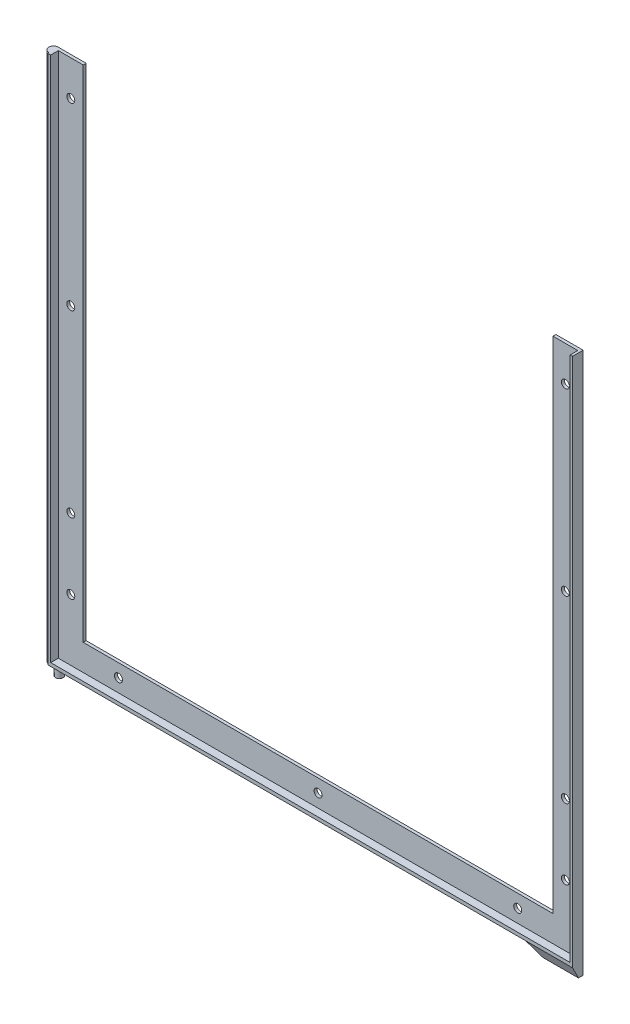
ISO-10303-21;
HEADER;
FILE_DESCRIPTION(('STEP AP214'),'2;1');
FILE_NAME('part.step','',(''),(''),'','','');
FILE_SCHEMA(('AUTOMOTIVE_DESIGN { 1 0 10303 214 1 1 1 1 }'));
ENDSEC;
DATA;
#1=APPLICATION_CONTEXT('core data for automotive mechanical design processes');
#2=APPLICATION_PROTOCOL_DEFINITION('international standard','automotive_design',2000,#1);
#3=PRODUCT_CONTEXT('',#1,'mechanical');
#4=PRODUCT('Part','Part','',(#3));
#5=PRODUCT_RELATED_PRODUCT_CATEGORY('part','',(#4));
#6=PRODUCT_DEFINITION_FORMATION('','',#4);
#7=PRODUCT_DEFINITION_CONTEXT('part definition',#1,'design');
#8=PRODUCT_DEFINITION('design','',#6,#7);
#9=PRODUCT_DEFINITION_SHAPE('','',#8);
#10=(LENGTH_UNIT() NAMED_UNIT(*) SI_UNIT(.MILLI.,.METRE.));
#11=(NAMED_UNIT(*) PLANE_ANGLE_UNIT() SI_UNIT($,.RADIAN.));
#12=(NAMED_UNIT(*) SI_UNIT($,.STERADIAN.) SOLID_ANGLE_UNIT());
#13=UNCERTAINTY_MEASURE_WITH_UNIT(LENGTH_MEASURE(1.E-05),#10,'distance_accuracy_value','');
#14=(GEOMETRIC_REPRESENTATION_CONTEXT(3) GLOBAL_UNCERTAINTY_ASSIGNED_CONTEXT((#13)) GLOBAL_UNIT_ASSIGNED_CONTEXT((#10,
#11,#12)) REPRESENTATION_CONTEXT('',''));
#15=CARTESIAN_POINT('',(0.,0.,0.));
#16=DIRECTION('',(0.,0.,1.));
#17=DIRECTION('',(1.,0.,0.));
#18=AXIS2_PLACEMENT_3D('',#15,#16,#17);
#19=CARTESIAN_POINT('',(287.750005722046,290.248990058899,1.25));
#20=DIRECTION('',(-1.,0.,0.));
#21=DIRECTION('',(0.,0.,1.));
#22=AXIS2_PLACEMENT_3D('',#19,#20,#21);
#23=PLANE('',#22);
#24=DIRECTION('',(0.,1.,0.));
#25=VECTOR('',#24,1.);
#26=CARTESIAN_POINT('',(287.750005722046,59.7510002553463,4.5));
#27=LINE('',#26,#25);
#28=CARTESIAN_POINT('',(287.750005722046,64.749002456665,4.5));
#29=VERTEX_POINT('',#28);
#30=CARTESIAN_POINT('',(287.750005722046,290.248990058899,4.5));
#31=VERTEX_POINT('',#30);
#32=EDGE_CURVE('E199',#29,#31,#27,.T.);
#33=ORIENTED_EDGE('',*,*,#32,.F.);
#34=DIRECTION('',(0.,0.894355681297272,0.44735658632828));
#35=VECTOR('',#34,1.);
#36=CARTESIAN_POINT('',(287.750005722046,59.7510002553463,2.));
#37=LINE('',#36,#35);
#38=CARTESIAN_POINT('',(287.750005722046,59.7510002553463,2.));
#39=VERTEX_POINT('',#38);
#40=EDGE_CURVE('E59',#39,#29,#37,.T.);
#41=ORIENTED_EDGE('',*,*,#40,.F.);
#42=DIRECTION('',(0.,0.,-1.));
#43=VECTOR('',#42,1.);
#44=CARTESIAN_POINT('',(287.750005722046,59.7510002553463,1.25));
#45=LINE('',#44,#43);
#46=CARTESIAN_POINT('',(287.750005722046,59.7510002553463,0.));
#47=VERTEX_POINT('',#46);
#48=EDGE_CURVE('E211',#39,#47,#45,.T.);
#49=ORIENTED_EDGE('',*,*,#48,.T.);
#50=DIRECTION('',(0.,1.,0.));
#51=VECTOR('',#50,1.);
#52=CARTESIAN_POINT('',(287.750005722046,290.248990058899,0.));
#53=LINE('',#52,#51);
#54=CARTESIAN_POINT('',(287.750005722046,290.248990058899,0.));
#55=VERTEX_POINT('',#54);
#56=EDGE_CURVE('E332',#47,#55,#53,.T.);
#57=ORIENTED_EDGE('',*,*,#56,.T.);
#58=DIRECTION('',(0.,0.,-1.));
#59=VECTOR('',#58,1.);
#60=CARTESIAN_POINT('',(287.750005722046,290.248990058899,1.25));
#61=LINE('',#60,#59);
#62=EDGE_CURVE('E223',#31,#55,#61,.T.);
#63=ORIENTED_EDGE('',*,*,#62,.F.);
#64=EDGE_LOOP('',(#33,#41,#49,#57,#63));
#65=FACE_BOUND('',#64,.T.);
#66=ADVANCED_FACE('F41',(#65),#23,.F.);
#67=CARTESIAN_POINT('',(276.148021221161,290.248990058899,1.25));
#68=DIRECTION('',(0.,-1.,0.));
#69=DIRECTION('',(0.,0.,-1.));
#70=AXIS2_PLACEMENT_3D('',#67,#68,#69);
#71=PLANE('',#70);
#72=DIRECTION('',(-1.,0.,0.));
#73=VECTOR('',#72,1.);
#74=CARTESIAN_POINT('',(276.148021221161,290.248990058899,0.));
#75=LINE('',#74,#73);
#76=CARTESIAN_POINT('',(276.148021221161,290.248990058899,0.));
#77=VERTEX_POINT('',#76);
#78=EDGE_CURVE('E352',#55,#77,#75,.T.);
#79=ORIENTED_EDGE('',*,*,#78,.T.);
#80=DIRECTION('',(0.,0.,-1.));
#81=VECTOR('',#80,1.);
#82=CARTESIAN_POINT('',(276.148021221161,290.248990058899,1.25));
#83=LINE('',#82,#81);
#84=CARTESIAN_POINT('',(276.148021221161,290.248990058899,1.25));
#85=VERTEX_POINT('',#84);
#86=EDGE_CURVE('E220',#85,#77,#83,.T.);
#87=ORIENTED_EDGE('',*,*,#86,.F.);
#88=DIRECTION('',(-1.,0.,0.));
#89=VECTOR('',#88,1.);
#90=CARTESIAN_POINT('',(276.148021221161,290.248990058899,1.25));
#91=LINE('',#90,#89);
#92=CARTESIAN_POINT('',(286.750037509555,290.248990058899,1.25));
#93=VERTEX_POINT('',#92);
#94=EDGE_CURVE('E338',#93,#85,#91,.T.);
#95=ORIENTED_EDGE('',*,*,#94,.F.);
#96=DIRECTION('',(0.,0.,-1.));
#97=VECTOR('',#96,1.);
#98=CARTESIAN_POINT('',(286.750037509555,290.248990058899,4.5));
#99=LINE('',#98,#97);
#100=CARTESIAN_POINT('',(286.750037509555,290.248990058899,4.5));
#101=VERTEX_POINT('',#100);
#102=EDGE_CURVE('E335',#101,#93,#99,.T.);
#103=ORIENTED_EDGE('',*,*,#102,.F.);
#104=DIRECTION('',(1.,0.,0.));
#105=VECTOR('',#104,1.);
#106=CARTESIAN_POINT('',(286.750037509555,290.248990058899,4.5));
#107=LINE('',#106,#105);
#108=EDGE_CURVE('E376',#101,#31,#107,.T.);
#109=ORIENTED_EDGE('',*,*,#108,.T.);
#110=ORIENTED_EDGE('',*,*,#62,.T.);
#111=EDGE_LOOP('',(#79,#87,#95,#103,#109,#110));
#112=FACE_BOUND('',#111,.T.);
#113=ADVANCED_FACE('F282',(#112),#71,.F.);
#114=CARTESIAN_POINT('',(276.148021221161,77.3487016558647,1.25));
#115=DIRECTION('',(1.,0.,0.));
#116=DIRECTION('',(0.,0.,-1.));
#117=AXIS2_PLACEMENT_3D('',#114,#115,#116);
#118=PLANE('',#117);
#119=DIRECTION('',(0.,-1.,0.));
#120=VECTOR('',#119,1.);
#121=CARTESIAN_POINT('',(276.148021221161,77.3487016558647,0.));
#122=LINE('',#121,#120);
#123=CARTESIAN_POINT('',(276.148021221161,77.3487016558647,0.));
#124=VERTEX_POINT('',#123);
#125=EDGE_CURVE('E354',#77,#124,#122,.T.);
#126=ORIENTED_EDGE('',*,*,#125,.T.);
#127=DIRECTION('',(0.,0.,-1.));
#128=VECTOR('',#127,1.);
#129=CARTESIAN_POINT('',(276.148021221161,77.3487016558647,1.25));
#130=LINE('',#129,#128);
#131=CARTESIAN_POINT('',(276.148021221161,77.3487016558647,1.25));
#132=VERTEX_POINT('',#131);
#133=EDGE_CURVE('E217',#132,#124,#130,.T.);
#134=ORIENTED_EDGE('',*,*,#133,.F.);
#135=DIRECTION('',(0.,-1.,0.));
#136=VECTOR('',#135,1.);
#137=CARTESIAN_POINT('',(276.148021221161,77.3487016558647,1.25));
#138=LINE('',#137,#136);
#139=EDGE_CURVE('E340',#85,#132,#138,.T.);
#140=ORIENTED_EDGE('',*,*,#139,.F.);
#141=ORIENTED_EDGE('',*,*,#86,.T.);
#142=EDGE_LOOP('',(#126,#134,#140,#141));
#143=FACE_BOUND('',#142,.T.);
#144=ADVANCED_FACE('F278',(#143),#118,.F.);
#145=CARTESIAN_POINT('',(76.1499032378197,77.3487016558647,1.25));
#146=DIRECTION('',(0.,-1.,0.));
#147=DIRECTION('',(0.,0.,-1.));
#148=AXIS2_PLACEMENT_3D('',#145,#146,#147);
#149=PLANE('',#148);
#150=DIRECTION('',(-1.,0.,0.));
#151=VECTOR('',#150,1.);
#152=CARTESIAN_POINT('',(76.1499032378197,77.3487016558647,0.));
#153=LINE('',#152,#151);
#154=CARTESIAN_POINT('',(76.1499032378197,77.3487016558647,0.));
#155=VERTEX_POINT('',#154);
#156=EDGE_CURVE('E356',#124,#155,#153,.T.);
#157=ORIENTED_EDGE('',*,*,#156,.T.);
#158=DIRECTION('',(0.,0.,-1.));
#159=VECTOR('',#158,1.);
#160=CARTESIAN_POINT('',(76.1499032378197,77.3487016558647,1.25));
#161=LINE('',#160,#159);
#162=CARTESIAN_POINT('',(76.1499032378197,77.3487016558647,1.25));
#163=VERTEX_POINT('',#162);
#164=EDGE_CURVE('E209',#163,#155,#161,.T.);
#165=ORIENTED_EDGE('',*,*,#164,.F.);
#166=DIRECTION('',(-1.,0.,0.));
#167=VECTOR('',#166,1.);
#168=CARTESIAN_POINT('',(76.1499032378197,77.3487016558647,1.25));
#169=LINE('',#168,#167);
#170=EDGE_CURVE('E343',#132,#163,#169,.T.);
#171=ORIENTED_EDGE('',*,*,#170,.F.);
#172=ORIENTED_EDGE('',*,*,#133,.T.);
#173=EDGE_LOOP('',(#157,#165,#171,#172));
#174=FACE_BOUND('',#173,.T.);
#175=ADVANCED_FACE('F274',(#174),#149,.F.);
#176=CARTESIAN_POINT('',(76.1499032378197,290.248990058899,1.25));
#177=DIRECTION('',(-1.,0.,0.));
#178=DIRECTION('',(0.,0.,1.));
#179=AXIS2_PLACEMENT_3D('',#176,#177,#178);
#180=PLANE('',#179);
#181=DIRECTION('',(0.,1.,0.));
#182=VECTOR('',#181,1.);
#183=CARTESIAN_POINT('',(76.1499032378197,290.248990058899,0.));
#184=LINE('',#183,#182);
#185=CARTESIAN_POINT('',(76.1499032378197,290.248990058899,0.));
#186=VERTEX_POINT('',#185);
#187=EDGE_CURVE('E358',#155,#186,#184,.T.);
#188=ORIENTED_EDGE('',*,*,#187,.T.);
#189=DIRECTION('',(0.,0.,-1.));
#190=VECTOR('',#189,1.);
#191=CARTESIAN_POINT('',(76.1499032378197,290.248990058899,1.25));
#192=LINE('',#191,#190);
#193=CARTESIAN_POINT('',(76.1499032378197,290.248990058899,1.25));
#194=VERTEX_POINT('',#193);
#195=EDGE_CURVE('E206',#194,#186,#192,.T.);
#196=ORIENTED_EDGE('',*,*,#195,.F.);
#197=DIRECTION('',(0.,1.,0.));
#198=VECTOR('',#197,1.);
#199=CARTESIAN_POINT('',(76.1499032378197,290.248990058899,1.25));
#200=LINE('',#199,#198);
#201=EDGE_CURVE('E345',#163,#194,#200,.T.);
#202=ORIENTED_EDGE('',*,*,#201,.F.);
#203=ORIENTED_EDGE('',*,*,#164,.T.);
#204=EDGE_LOOP('',(#188,#196,#202,#203));
#205=FACE_BOUND('',#204,.T.);
#206=ADVANCED_FACE('F270',(#205),#180,.F.);
#207=CARTESIAN_POINT('',(64.5539984107018,290.248990058899,1.25));
#208=DIRECTION('',(0.,-1.,0.));
#209=DIRECTION('',(0.,0.,-1.));
#210=AXIS2_PLACEMENT_3D('',#207,#208,#209);
#211=PLANE('',#210);
#212=CARTESIAN_POINT('',(64.2467486882387,290.248990058899,1.99631338144911));
#213=DIRECTION('',(0.,-1.,0.));
#214=DIRECTION('',(0.,0.,-1.));
#215=AXIS2_PLACEMENT_3D('',#212,#213,#214);
#216=CIRCLE('',#215,1.99831374838364);
#217=CARTESIAN_POINT('',(64.2012415621185,290.248990058899,3.99410890112859));
#218=VERTEX_POINT('',#217);
#219=CARTESIAN_POINT('',(64.1573578608217,290.248990058899,0.));
#220=VERTEX_POINT('',#219);
#221=EDGE_CURVE('E308',#218,#220,#216,.T.);
#222=ORIENTED_EDGE('',*,*,#221,.F.);
#223=DIRECTION('',(0.422618261740701,0.,0.906307787036649));
#224=VECTOR('',#223,1.);
#225=CARTESIAN_POINT('',(64.4371424557147,290.248990058899,4.5));
#226=LINE('',#225,#224);
#227=CARTESIAN_POINT('',(64.4371424557147,290.248990058899,4.5));
#228=VERTEX_POINT('',#227);
#229=EDGE_CURVE('E229',#218,#228,#226,.T.);
#230=ORIENTED_EDGE('',*,*,#229,.T.);
#231=DIRECTION('',(1.,0.,0.));
#232=VECTOR('',#231,1.);
#233=CARTESIAN_POINT('',(64.5539984107018,290.248990058899,4.5));
#234=LINE('',#233,#232);
#235=CARTESIAN_POINT('',(65.5479948411394,290.248990058899,4.5));
#236=VERTEX_POINT('',#235);
#237=EDGE_CURVE('E198',#228,#236,#234,.T.);
#238=ORIENTED_EDGE('',*,*,#237,.T.);
#239=DIRECTION('',(0.,0.,-1.));
#240=VECTOR('',#239,1.);
#241=CARTESIAN_POINT('',(65.5479948411394,290.248990058899,4.5));
#242=LINE('',#241,#240);
#243=CARTESIAN_POINT('',(65.5479948411394,290.248990058899,1.25));
#244=VERTEX_POINT('',#243);
#245=EDGE_CURVE('E333',#236,#244,#242,.T.);
#246=ORIENTED_EDGE('',*,*,#245,.T.);
#247=DIRECTION('',(-1.,0.,0.));
#248=VECTOR('',#247,1.);
#249=CARTESIAN_POINT('',(64.5539984107018,290.248990058899,1.25));
#250=LINE('',#249,#248);
#251=EDGE_CURVE('E347',#194,#244,#250,.T.);
#252=ORIENTED_EDGE('',*,*,#251,.F.);
#253=ORIENTED_EDGE('',*,*,#195,.T.);
#254=DIRECTION('',(-1.,0.,0.));
#255=VECTOR('',#254,1.);
#256=CARTESIAN_POINT('',(64.5539984107018,290.248990058899,0.));
#257=LINE('',#256,#255);
#258=EDGE_CURVE('E360',#186,#220,#257,.T.);
#259=ORIENTED_EDGE('',*,*,#258,.T.);
#260=EDGE_LOOP('',(#222,#230,#238,#246,#252,#253,#259));
#261=FACE_BOUND('',#260,.T.);
#262=ADVANCED_FACE('F267',(#261),#211,.F.);
#263=CARTESIAN_POINT('',(267.749905586243,64.749002456665,1.25));
#264=DIRECTION('',(0.,1.,0.));
#265=DIRECTION('',(0.,0.,1.));
#266=AXIS2_PLACEMENT_3D('',#263,#264,#265);
#267=PLANE('',#266);
#268=CARTESIAN_POINT('',(64.2467486882387,64.749002456665,1.99631338144911));
#269=DIRECTION('',(0.,1.,0.));
#270=DIRECTION('',(0.,0.,1.));
#271=AXIS2_PLACEMENT_3D('',#268,#269,#270);
#272=CIRCLE('',#271,1.99831374838364);
#273=CARTESIAN_POINT('',(63.8970407202618,64.749002456665,0.0288372890625906));
#274=VERTEX_POINT('',#273);
#275=CARTESIAN_POINT('',(64.2012415621185,64.749002456665,3.99410890112858));
#276=VERTEX_POINT('',#275);
#277=EDGE_CURVE('E187',#274,#276,#272,.T.);
#278=ORIENTED_EDGE('',*,*,#277,.F.);
#279=CARTESIAN_POINT('',(65.7489448333469,64.749002456665,1.01901462466386));
#280=DIRECTION('',(0.,1.,0.));
#281=DIRECTION('',(0.,0.,1.));
#282=AXIS2_PLACEMENT_3D('',#279,#280,#281);
#283=CIRCLE('',#282,2.1);
#284=CARTESIAN_POINT('',(67.5851390482166,64.749002456665,0.));
#285=VERTEX_POINT('',#284);
#286=EDGE_CURVE('E234',#274,#285,#283,.T.);
#287=ORIENTED_EDGE('',*,*,#286,.T.);
#288=DIRECTION('',(1.,0.,0.));
#289=VECTOR('',#288,1.);
#290=CARTESIAN_POINT('',(267.749905586243,64.749002456665,0.));
#291=LINE('',#290,#289);
#292=CARTESIAN_POINT('',(267.749905586243,64.749002456665,0.));
#293=VERTEX_POINT('',#292);
#294=EDGE_CURVE('E205',#285,#293,#291,.T.);
#295=ORIENTED_EDGE('',*,*,#294,.T.);
#296=DIRECTION('',(0.,0.,-1.));
#297=VECTOR('',#296,1.);
#298=CARTESIAN_POINT('',(267.749905586243,64.749002456665,1.25));
#299=LINE('',#298,#297);
#300=CARTESIAN_POINT('',(267.749905586243,64.749002456665,4.5));
#301=VERTEX_POINT('',#300);
#302=EDGE_CURVE('E184',#301,#293,#299,.T.);
#303=ORIENTED_EDGE('',*,*,#302,.F.);
#304=DIRECTION('',(1.,0.,0.));
#305=VECTOR('',#304,1.);
#306=CARTESIAN_POINT('',(64.1573578608217,64.749002456665,4.5));
#307=LINE('',#306,#305);
#308=CARTESIAN_POINT('',(64.4371424557147,64.749002456665,4.5));
#309=VERTEX_POINT('',#308);
#310=EDGE_CURVE('E191',#309,#301,#307,.T.);
#311=ORIENTED_EDGE('',*,*,#310,.F.);
#312=DIRECTION('',(-0.422618261740701,0.,-0.906307787036649));
#313=VECTOR('',#312,1.);
#314=CARTESIAN_POINT('',(64.4371424557147,64.749002456665,4.5));
#315=LINE('',#314,#313);
#316=EDGE_CURVE('E227',#309,#276,#315,.T.);
#317=ORIENTED_EDGE('',*,*,#316,.T.);
#318=EDGE_LOOP('',(#278,#287,#295,#303,#311,#317));
#319=FACE_BOUND('',#318,.T.);
#320=ADVANCED_FACE('F202',(#319),#267,.F.);
#321=CARTESIAN_POINT('',(272.747904062271,59.7510002553463,1.25));
#322=DIRECTION('',(0.707107044709693,0.707106517663304,0.));
#323=DIRECTION('',(-0.707106517663304,0.707107044709693,0.));
#324=AXIS2_PLACEMENT_3D('',#321,#322,#323);
#325=PLANE('',#324);
#326=DIRECTION('',(0.,0.,-1.));
#327=VECTOR('',#326,1.);
#328=CARTESIAN_POINT('',(272.747904062271,59.7510002553463,1.25));
#329=LINE('',#328,#327);
#330=CARTESIAN_POINT('',(272.747904062271,59.7510002553463,2.));
#331=VERTEX_POINT('',#330);
#332=CARTESIAN_POINT('',(272.747904062271,59.7510002553463,0.));
#333=VERTEX_POINT('',#332);
#334=EDGE_CURVE('E186',#331,#333,#329,.T.);
#335=ORIENTED_EDGE('',*,*,#334,.F.);
#336=DIRECTION('',(-0.666636777809004,0.666637274691012,0.33345187128725));
#337=VECTOR('',#336,1.);
#338=CARTESIAN_POINT('',(272.914622523043,59.5842816703096,1.91660738715127));
#339=LINE('',#338,#337);
#340=EDGE_CURVE('E171',#331,#301,#339,.T.);
#341=ORIENTED_EDGE('',*,*,#340,.T.);
#342=ORIENTED_EDGE('',*,*,#302,.T.);
#343=DIRECTION('',(0.707106517663304,-0.707107044709693,0.));
#344=VECTOR('',#343,1.);
#345=CARTESIAN_POINT('',(272.747904062271,59.7510002553463,0.));
#346=LINE('',#345,#344);
#347=EDGE_CURVE('E363',#293,#333,#346,.T.);
#348=ORIENTED_EDGE('',*,*,#347,.T.);
#349=EDGE_LOOP('',(#335,#341,#342,#348));
#350=FACE_BOUND('',#349,.T.);
#351=ADVANCED_FACE('F181',(#350),#325,.F.);
#352=CARTESIAN_POINT('',(287.750005722046,59.7510002553463,1.25));
#353=DIRECTION('',(0.,1.,0.));
#354=DIRECTION('',(0.,0.,1.));
#355=AXIS2_PLACEMENT_3D('',#352,#353,#354);
#356=PLANE('',#355);
#357=ORIENTED_EDGE('',*,*,#48,.F.);
#358=DIRECTION('',(1.,0.,0.));
#359=VECTOR('',#358,1.);
#360=CARTESIAN_POINT('',(267.749905586243,59.7510002553463,2.));
#361=LINE('',#360,#359);
#362=EDGE_CURVE('E176',#331,#39,#361,.T.);
#363=ORIENTED_EDGE('',*,*,#362,.F.);
#364=ORIENTED_EDGE('',*,*,#334,.T.);
#365=DIRECTION('',(1.,0.,0.));
#366=VECTOR('',#365,1.);
#367=CARTESIAN_POINT('',(287.750005722046,59.7510002553463,0.));
#368=LINE('',#367,#366);
#369=EDGE_CURVE('E341',#333,#47,#368,.T.);
#370=ORIENTED_EDGE('',*,*,#369,.T.);
#371=EDGE_LOOP('',(#357,#363,#364,#370));
#372=FACE_BOUND('',#371,.T.);
#373=ADVANCED_FACE('F258',(#372),#356,.F.);
#374=CARTESIAN_POINT('',(0.,0.,1.25));
#375=DIRECTION('',(0.,0.,-1.));
#376=DIRECTION('',(-1.,0.,0.));
#377=AXIS2_PLACEMENT_3D('',#374,#375,#376);
#378=PLANE('',#377);
#379=CARTESIAN_POINT('',(281.447800089137,198.799864885344,1.25));
#380=DIRECTION('',(0.,0.,1.));
#381=DIRECTION('',(-1.,0.,0.));
#382=AXIS2_PLACEMENT_3D('',#379,#380,#381);
#383=CIRCLE('',#382,1.70000000000001);
#384=CARTESIAN_POINT('',(279.747800089137,198.799864885344,1.25));
#385=VERTEX_POINT('',#384);
#386=EDGE_CURVE('E416',#385,#385,#383,.T.);
#387=ORIENTED_EDGE('',*,*,#386,.F.);
#388=EDGE_LOOP('',(#387));
#389=FACE_BOUND('',#388,.T.);
#390=CARTESIAN_POINT('',(281.448539930159,122.349720687407,1.25));
#391=DIRECTION('',(0.,0.,1.));
#392=DIRECTION('',(-1.,0.,0.));
#393=AXIS2_PLACEMENT_3D('',#390,#391,#392);
#394=CIRCLE('',#393,1.70000000000001);
#395=CARTESIAN_POINT('',(279.748539930159,122.349720687407,1.25));
#396=VERTEX_POINT('',#395);
#397=EDGE_CURVE('E419',#396,#396,#394,.T.);
#398=ORIENTED_EDGE('',*,*,#397,.F.);
#399=EDGE_LOOP('',(#398));
#400=FACE_BOUND('',#399,.T.);
#401=CARTESIAN_POINT('',(70.8489490394796,198.798845857382,1.25));
#402=DIRECTION('',(0.,0.,1.));
#403=DIRECTION('',(1.,0.,0.));
#404=AXIS2_PLACEMENT_3D('',#401,#402,#403);
#405=CIRCLE('',#404,1.70000000000001);
#406=CARTESIAN_POINT('',(72.5489490394796,198.798845857382,1.25));
#407=VERTEX_POINT('',#406);
#408=EDGE_CURVE('E423',#407,#407,#405,.T.);
#409=ORIENTED_EDGE('',*,*,#408,.F.);
#410=EDGE_LOOP('',(#409));
#411=FACE_BOUND('',#410,.T.);
#412=CARTESIAN_POINT('',(70.8489490394795,275.248990058899,1.25));
#413=DIRECTION('',(0.,0.,1.));
#414=DIRECTION('',(1.,0.,0.));
#415=AXIS2_PLACEMENT_3D('',#412,#413,#414);
#416=CIRCLE('',#415,1.69999999999999);
#417=CARTESIAN_POINT('',(72.5489490394795,275.248990058899,1.25));
#418=VERTEX_POINT('',#417);
#419=EDGE_CURVE('E408',#418,#418,#416,.T.);
#420=ORIENTED_EDGE('',*,*,#419,.F.);
#421=EDGE_LOOP('',(#420));
#422=FACE_BOUND('',#421,.T.);
#423=CARTESIAN_POINT('',(70.8489490394795,92.3487016558647,1.25));
#424=DIRECTION('',(0.,0.,1.));
#425=DIRECTION('',(1.,0.,0.));
#426=AXIS2_PLACEMENT_3D('',#423,#424,#425);
#427=CIRCLE('',#426,1.7);
#428=CARTESIAN_POINT('',(72.5489490394796,92.3487016558647,1.25));
#429=VERTEX_POINT('',#428);
#430=EDGE_CURVE('E404',#429,#429,#427,.T.);
#431=ORIENTED_EDGE('',*,*,#430,.F.);
#432=EDGE_LOOP('',(#431));
#433=FACE_BOUND('',#432,.T.);
#434=CARTESIAN_POINT('',(70.8489490394795,122.348701655865,1.25));
#435=DIRECTION('',(0.,0.,1.));
#436=DIRECTION('',(1.,0.,0.));
#437=AXIS2_PLACEMENT_3D('',#434,#435,#436);
#438=CIRCLE('',#437,1.7);
#439=CARTESIAN_POINT('',(72.5489490394795,122.348701655865,1.25));
#440=VERTEX_POINT('',#439);
#441=EDGE_CURVE('E407',#440,#440,#438,.T.);
#442=ORIENTED_EDGE('',*,*,#441,.F.);
#443=EDGE_LOOP('',(#442));
#444=FACE_BOUND('',#443,.T.);
#445=CARTESIAN_POINT('',(261.148075163038,71.7751259372834,1.25));
#446=DIRECTION('',(0.,0.,1.));
#447=DIRECTION('',(-1.,0.,0.));
#448=AXIS2_PLACEMENT_3D('',#445,#446,#447);
#449=CIRCLE('',#448,1.70000000000001);
#450=CARTESIAN_POINT('',(259.448075163037,71.7751259372834,1.25));
#451=VERTEX_POINT('',#450);
#452=EDGE_CURVE('E411',#451,#451,#449,.T.);
#453=ORIENTED_EDGE('',*,*,#452,.F.);
#454=EDGE_LOOP('',(#453));
#455=FACE_BOUND('',#454,.T.);
#456=CARTESIAN_POINT('',(91.1499032378197,71.7743033644638,1.25));
#457=DIRECTION('',(0.,0.,1.));
#458=DIRECTION('',(1.,0.,0.));
#459=AXIS2_PLACEMENT_3D('',#456,#457,#458);
#460=CIRCLE('',#459,1.7);
#461=CARTESIAN_POINT('',(92.8499032378197,71.7743033644638,1.25));
#462=VERTEX_POINT('',#461);
#463=EDGE_CURVE('E403',#462,#462,#460,.T.);
#464=ORIENTED_EDGE('',*,*,#463,.F.);
#465=EDGE_LOOP('',(#464));
#466=FACE_BOUND('',#465,.T.);
#467=CARTESIAN_POINT('',(281.447060248114,275.250009083281,1.25));
#468=DIRECTION('',(0.,0.,1.));
#469=DIRECTION('',(-1.,0.,0.));
#470=AXIS2_PLACEMENT_3D('',#467,#468,#469);
#471=CIRCLE('',#470,1.70000000000004);
#472=CARTESIAN_POINT('',(279.747060248114,275.250009083281,1.25));
#473=VERTEX_POINT('',#472);
#474=EDGE_CURVE('E420',#473,#473,#471,.T.);
#475=ORIENTED_EDGE('',*,*,#474,.F.);
#476=EDGE_LOOP('',(#475));
#477=FACE_BOUND('',#476,.T.);
#478=CARTESIAN_POINT('',(281.4488302531,92.3497206888116,1.25));
#479=DIRECTION('',(0.,0.,1.));
#480=DIRECTION('',(-1.,0.,0.));
#481=AXIS2_PLACEMENT_3D('',#478,#479,#480);
#482=CIRCLE('',#481,1.70000000000001);
#483=CARTESIAN_POINT('',(279.7488302531,92.3497206888116,1.25));
#484=VERTEX_POINT('',#483);
#485=EDGE_CURVE('E428',#484,#484,#482,.T.);
#486=ORIENTED_EDGE('',*,*,#485,.F.);
#487=EDGE_LOOP('',(#486));
#488=FACE_BOUND('',#487,.T.);
#489=CARTESIAN_POINT('',(176.148989202419,71.7743033644638,1.25));
#490=DIRECTION('',(0.,0.,1.));
#491=DIRECTION('',(1.,0.,0.));
#492=AXIS2_PLACEMENT_3D('',#489,#490,#491);
#493=CIRCLE('',#492,1.70000000000001);
#494=CARTESIAN_POINT('',(177.848989202419,71.7743033644638,1.25));
#495=VERTEX_POINT('',#494);
#496=EDGE_CURVE('E399',#495,#495,#493,.T.);
#497=ORIENTED_EDGE('',*,*,#496,.F.);
#498=EDGE_LOOP('',(#497));
#499=FACE_BOUND('',#498,.T.);
#500=DIRECTION('',(1.,0.,0.));
#501=VECTOR('',#500,1.);
#502=CARTESIAN_POINT('',(65.5479948411394,66.1999050730628,1.25));
#503=LINE('',#502,#501);
#504=CARTESIAN_POINT('',(65.5479948411394,66.1999050730628,1.25));
#505=VERTEX_POINT('',#504);
#506=CARTESIAN_POINT('',(286.750037509555,66.1999050730628,1.25));
#507=VERTEX_POINT('',#506);
#508=EDGE_CURVE('E318',#505,#507,#503,.T.);
#509=ORIENTED_EDGE('',*,*,#508,.T.);
#510=DIRECTION('',(0.,1.,0.));
#511=VECTOR('',#510,1.);
#512=CARTESIAN_POINT('',(286.750037509555,66.1999050730628,1.25));
#513=LINE('',#512,#511);
#514=EDGE_CURVE('E321',#507,#93,#513,.T.);
#515=ORIENTED_EDGE('',*,*,#514,.T.);
#516=ORIENTED_EDGE('',*,*,#94,.T.);
#517=ORIENTED_EDGE('',*,*,#139,.T.);
#518=ORIENTED_EDGE('',*,*,#170,.T.);
#519=ORIENTED_EDGE('',*,*,#201,.T.);
#520=ORIENTED_EDGE('',*,*,#251,.T.);
#521=DIRECTION('',(0.,-1.,0.));
#522=VECTOR('',#521,1.);
#523=CARTESIAN_POINT('',(65.5479948411394,290.248990058899,1.25));
#524=LINE('',#523,#522);
#525=EDGE_CURVE('E325',#244,#505,#524,.T.);
#526=ORIENTED_EDGE('',*,*,#525,.T.);
#527=EDGE_LOOP('',(#509,#515,#516,#517,#518,#519,#520,#526));
#528=FACE_BOUND('',#527,.T.);
#529=ADVANCED_FACE('F255',(#389,#400,#411,#422,#433,#444,#455,#466,#477,#488,#499,#528),#378,.F.);
#530=CARTESIAN_POINT('',(0.,0.,0.));
#531=DIRECTION('',(0.,0.,-1.));
#532=DIRECTION('',(-1.,0.,0.));
#533=AXIS2_PLACEMENT_3D('',#530,#531,#532);
#534=PLANE('',#533);
#535=CARTESIAN_POINT('',(281.447800089137,198.799864885344,0.));
#536=DIRECTION('',(0.,0.,-1.));
#537=DIRECTION('',(-1.,0.,0.));
#538=AXIS2_PLACEMENT_3D('',#535,#536,#537);
#539=CIRCLE('',#538,1.70000000000001);
#540=CARTESIAN_POINT('',(279.747800089137,198.799864885344,0.));
#541=VERTEX_POINT('',#540);
#542=EDGE_CURVE('E46',#541,#541,#539,.T.);
#543=ORIENTED_EDGE('',*,*,#542,.F.);
#544=EDGE_LOOP('',(#543));
#545=FACE_BOUND('',#544,.T.);
#546=CARTESIAN_POINT('',(281.448539930159,122.349720687407,0.));
#547=DIRECTION('',(0.,0.,-1.));
#548=DIRECTION('',(-1.,0.,0.));
#549=AXIS2_PLACEMENT_3D('',#546,#547,#548);
#550=CIRCLE('',#549,1.70000000000001);
#551=CARTESIAN_POINT('',(279.748539930159,122.349720687407,0.));
#552=VERTEX_POINT('',#551);
#553=EDGE_CURVE('E722',#552,#552,#550,.T.);
#554=ORIENTED_EDGE('',*,*,#553,.F.);
#555=EDGE_LOOP('',(#554));
#556=FACE_BOUND('',#555,.T.);
#557=CARTESIAN_POINT('',(70.8489490394796,198.798845857382,0.));
#558=DIRECTION('',(0.,0.,-1.));
#559=DIRECTION('',(-1.,0.,0.));
#560=AXIS2_PLACEMENT_3D('',#557,#558,#559);
#561=CIRCLE('',#560,1.70000000000001);
#562=CARTESIAN_POINT('',(69.1489490394795,198.798845857382,0.));
#563=VERTEX_POINT('',#562);
#564=EDGE_CURVE('E724',#563,#563,#561,.T.);
#565=ORIENTED_EDGE('',*,*,#564,.F.);
#566=EDGE_LOOP('',(#565));
#567=FACE_BOUND('',#566,.T.);
#568=CARTESIAN_POINT('',(70.8489490394795,275.248990058899,0.));
#569=DIRECTION('',(0.,0.,-1.));
#570=DIRECTION('',(-1.,0.,0.));
#571=AXIS2_PLACEMENT_3D('',#568,#569,#570);
#572=CIRCLE('',#571,1.69999999999999);
#573=CARTESIAN_POINT('',(69.1489490394795,275.248990058899,0.));
#574=VERTEX_POINT('',#573);
#575=EDGE_CURVE('E727',#574,#574,#572,.T.);
#576=ORIENTED_EDGE('',*,*,#575,.F.);
#577=EDGE_LOOP('',(#576));
#578=FACE_BOUND('',#577,.T.);
#579=CARTESIAN_POINT('',(70.8489490394795,92.3487016558647,0.));
#580=DIRECTION('',(0.,0.,-1.));
#581=DIRECTION('',(-1.,0.,0.));
#582=AXIS2_PLACEMENT_3D('',#579,#580,#581);
#583=CIRCLE('',#582,1.7);
#584=CARTESIAN_POINT('',(69.1489490394796,92.3487016558647,0.));
#585=VERTEX_POINT('',#584);
#586=EDGE_CURVE('E732',#585,#585,#583,.T.);
#587=ORIENTED_EDGE('',*,*,#586,.F.);
#588=EDGE_LOOP('',(#587));
#589=FACE_BOUND('',#588,.T.);
#590=CARTESIAN_POINT('',(70.8489490394795,122.348701655865,0.));
#591=DIRECTION('',(0.,0.,-1.));
#592=DIRECTION('',(-1.,0.,0.));
#593=AXIS2_PLACEMENT_3D('',#590,#591,#592);
#594=CIRCLE('',#593,1.7);
#595=CARTESIAN_POINT('',(69.1489490394795,122.348701655865,0.));
#596=VERTEX_POINT('',#595);
#597=EDGE_CURVE('E735',#596,#596,#594,.T.);
#598=ORIENTED_EDGE('',*,*,#597,.F.);
#599=EDGE_LOOP('',(#598));
#600=FACE_BOUND('',#599,.T.);
#601=CARTESIAN_POINT('',(261.148075163038,71.7751259372834,0.));
#602=DIRECTION('',(0.,0.,-1.));
#603=DIRECTION('',(-1.,0.,0.));
#604=AXIS2_PLACEMENT_3D('',#601,#602,#603);
#605=CIRCLE('',#604,1.70000000000001);
#606=CARTESIAN_POINT('',(259.448075163037,71.7751259372834,0.));
#607=VERTEX_POINT('',#606);
#608=EDGE_CURVE('E738',#607,#607,#605,.T.);
#609=ORIENTED_EDGE('',*,*,#608,.F.);
#610=EDGE_LOOP('',(#609));
#611=FACE_BOUND('',#610,.T.);
#612=CARTESIAN_POINT('',(91.1499032378197,71.7743033644638,0.));
#613=DIRECTION('',(0.,0.,-1.));
#614=DIRECTION('',(-1.,0.,0.));
#615=AXIS2_PLACEMENT_3D('',#612,#613,#614);
#616=CIRCLE('',#615,1.7);
#617=CARTESIAN_POINT('',(89.4499032378197,71.7743033644638,0.));
#618=VERTEX_POINT('',#617);
#619=EDGE_CURVE('E741',#618,#618,#616,.T.);
#620=ORIENTED_EDGE('',*,*,#619,.F.);
#621=EDGE_LOOP('',(#620));
#622=FACE_BOUND('',#621,.T.);
#623=CARTESIAN_POINT('',(281.447060248114,275.250009083281,0.));
#624=DIRECTION('',(0.,0.,-1.));
#625=DIRECTION('',(-1.,0.,0.));
#626=AXIS2_PLACEMENT_3D('',#623,#624,#625);
#627=CIRCLE('',#626,1.70000000000004);
#628=CARTESIAN_POINT('',(279.747060248114,275.250009083281,0.));
#629=VERTEX_POINT('',#628);
#630=EDGE_CURVE('E744',#629,#629,#627,.T.);
#631=ORIENTED_EDGE('',*,*,#630,.F.);
#632=EDGE_LOOP('',(#631));
#633=FACE_BOUND('',#632,.T.);
#634=CARTESIAN_POINT('',(281.4488302531,92.3497206888116,0.));
#635=DIRECTION('',(0.,0.,-1.));
#636=DIRECTION('',(-1.,0.,0.));
#637=AXIS2_PLACEMENT_3D('',#634,#635,#636);
#638=CIRCLE('',#637,1.70000000000001);
#639=CARTESIAN_POINT('',(279.7488302531,92.3497206888116,0.));
#640=VERTEX_POINT('',#639);
#641=EDGE_CURVE('E747',#640,#640,#638,.T.);
#642=ORIENTED_EDGE('',*,*,#641,.F.);
#643=EDGE_LOOP('',(#642));
#644=FACE_BOUND('',#643,.T.);
#645=CARTESIAN_POINT('',(176.148989202419,71.7743033644638,0.));
#646=DIRECTION('',(0.,0.,-1.));
#647=DIRECTION('',(-1.,0.,0.));
#648=AXIS2_PLACEMENT_3D('',#645,#646,#647);
#649=CIRCLE('',#648,1.70000000000001);
#650=CARTESIAN_POINT('',(174.448989202419,71.7743033644638,0.));
#651=VERTEX_POINT('',#650);
#652=EDGE_CURVE('E402',#651,#651,#649,.T.);
#653=ORIENTED_EDGE('',*,*,#652,.F.);
#654=EDGE_LOOP('',(#653));
#655=FACE_BOUND('',#654,.T.);
#656=ORIENTED_EDGE('',*,*,#56,.F.);
#657=ORIENTED_EDGE('',*,*,#369,.F.);
#658=ORIENTED_EDGE('',*,*,#347,.F.);
#659=ORIENTED_EDGE('',*,*,#294,.F.);
#660=CARTESIAN_POINT('',(67.5851390482166,64.749002456665,0.));
#661=CARTESIAN_POINT('',(67.5424944876605,64.7490012771005,0.));
#662=CARTESIAN_POINT('',(67.4998756498488,64.7448308936353,0.));
#663=CARTESIAN_POINT('',(67.4160432519512,64.7285628994434,0.));
#664=CARTESIAN_POINT('',(67.3748342010839,64.7164419742327,0.));
#665=CARTESIAN_POINT('',(67.2999151405496,64.6864774655736,0.));
#666=CARTESIAN_POINT('',(67.2658832890686,64.6694322662738,0.));
#667=CARTESIAN_POINT('',(67.2013411004239,64.6296653438743,0.));
#668=CARTESIAN_POINT('',(67.1708242623435,64.606954354156,0.));
#669=CARTESIAN_POINT('',(67.1216997663951,64.5624247200899,0.));
#670=CARTESIAN_POINT('',(67.1020175223191,64.5417879357427,0.));
#671=CARTESIAN_POINT('',(67.0662330024878,64.4976011636859,0.));
#672=CARTESIAN_POINT('',(67.0501265321765,64.4740546402783,0.));
#673=CARTESIAN_POINT('',(67.0248321702567,64.4286780069514,0.));
#674=CARTESIAN_POINT('',(67.0149315138032,64.4072458882963,0.));
#675=CARTESIAN_POINT('',(66.9988435610887,64.3630449018112,0.));
#676=CARTESIAN_POINT('',(66.9926483201922,64.3402790096609,0.));
#677=CARTESIAN_POINT('',(66.986524548562,64.3059197028655,0.));
#678=CARTESIAN_POINT('',(66.9850116360928,64.2945920391051,0.));
#679=CARTESIAN_POINT('',(66.9829885011476,64.271845941302,0.));
#680=CARTESIAN_POINT('',(66.9824784348491,64.2604274933989,0.));
#681=CARTESIAN_POINT('',(66.9824800759431,64.2490024566646,0.));
#682=B_SPLINE_CURVE_WITH_KNOTS('',3,(#660,#661,#662,#663,#664,#665,#666,#667,#668,#669,#670,
#671,#672,#673,#674,#675,#676,#677,#678,#679,#680,#681),.UNSPECIFIED.,.F.,.F.,(4,2,2,2,2,2,2,2,
2,2,4),(0.,0.127711027738859,0.255798244764988,0.369457771935524,0.482903594007702,
0.56814554789566,0.653286974200457,0.723829324335316,0.794219880107311,0.828465713385493,
0.86271687948529),.UNSPECIFIED.);
#683=CARTESIAN_POINT('',(66.9824800759408,64.249002456665,0.));
#684=VERTEX_POINT('',#683);
#685=EDGE_CURVE('E238',#285,#684,#682,.T.);
#686=ORIENTED_EDGE('',*,*,#685,.T.);
#687=DIRECTION('',(0.,1.,0.));
#688=VECTOR('',#687,1.);
#689=CARTESIAN_POINT('',(66.9824800759408,59.749002456665,0.));
#690=LINE('',#689,#688);
#691=CARTESIAN_POINT('',(66.9824800759408,59.749002456665,0.));
#692=VERTEX_POINT('',#691);
#693=EDGE_CURVE('E384',#692,#684,#690,.T.);
#694=ORIENTED_EDGE('',*,*,#693,.F.);
#695=DIRECTION('',(1.,0.,0.));
#696=VECTOR('',#695,1.);
#697=CARTESIAN_POINT('',(64.515409590753,59.749002456665,0.));
#698=LINE('',#697,#696);
#699=CARTESIAN_POINT('',(64.515409590753,59.749002456665,0.));
#700=VERTEX_POINT('',#699);
#701=EDGE_CURVE('E387',#700,#692,#698,.T.);
#702=ORIENTED_EDGE('',*,*,#701,.F.);
#703=DIRECTION('',(0.,1.,0.));
#704=VECTOR('',#703,1.);
#705=CARTESIAN_POINT('',(64.515409590753,59.749002456665,0.));
#706=LINE('',#705,#704);
#707=CARTESIAN_POINT('',(64.515409590753,64.249002456665,0.));
#708=VERTEX_POINT('',#707);
#709=EDGE_CURVE('E322',#700,#708,#706,.T.);
#710=ORIENTED_EDGE('',*,*,#709,.T.);
#711=CARTESIAN_POINT('',(64.515409590753,64.249002456665,0.));
#712=CARTESIAN_POINT('',(64.5154644806946,64.2730642712439,0.));
#713=CARTESIAN_POINT('',(64.5131599336986,64.2970670512951,0.));
#714=CARTESIAN_POINT('',(64.5043156350971,64.3440861526736,0.));
#715=CARTESIAN_POINT('',(64.4978105229725,64.3671089150633,0.));
#716=CARTESIAN_POINT('',(64.4810572094535,64.4116539390414,0.));
#717=CARTESIAN_POINT('',(64.4708190157218,64.4331800308923,0.));
#718=CARTESIAN_POINT('',(64.4471938881133,64.4744680247505,0.));
#719=CARTESIAN_POINT('',(64.433799677903,64.4942257021274,0.));
#720=CARTESIAN_POINT('',(64.3993140003389,64.5382619279117,0.));
#721=CARTESIAN_POINT('',(64.3771671932885,64.5617141449575,0.));
#722=CARTESIAN_POINT('',(64.3293405903374,64.604702287504,0.));
#723=CARTESIAN_POINT('',(64.3036557837415,64.6242325603772,0.));
#724=CARTESIAN_POINT('',(64.2578431675382,64.6539178299387,0.));
#725=CARTESIAN_POINT('',(64.2383827904768,64.6651221687569,0.));
#726=CARTESIAN_POINT('',(64.1985303253529,64.6854499101409,0.));
#727=CARTESIAN_POINT('',(64.178143611233,64.6945838355234,0.));
#728=CARTESIAN_POINT('',(64.1573578608208,64.7026959014805,0.));
#729=B_SPLINE_CURVE_WITH_KNOTS('',3,(#711,#712,#713,#714,#715,#716,#717,#718,#719,#720,#721,
#722,#723,#724,#725,#726,#727,#728),.UNSPECIFIED.,.F.,.F.,(4,2,2,2,2,2,2,2,4),(0.,
0.0719818023986316,0.143377467109812,0.214583124522025,0.285954584369334,0.382216276270053,
0.478615728070318,0.545872666300845,0.612779700224069),.UNSPECIFIED.);
#730=CARTESIAN_POINT('',(64.1573578608217,64.7026959014818,0.));
#731=VERTEX_POINT('',#730);
#732=EDGE_CURVE('E51',#708,#731,#729,.T.);
#733=ORIENTED_EDGE('',*,*,#732,.T.);
#734=DIRECTION('',(0.,1.,0.));
#735=VECTOR('',#734,1.);
#736=CARTESIAN_POINT('',(64.1573578608217,290.248990058899,0.));
#737=LINE('',#736,#735);
#738=EDGE_CURVE('E66',#731,#220,#737,.T.);
#739=ORIENTED_EDGE('',*,*,#738,.T.);
#740=ORIENTED_EDGE('',*,*,#258,.F.);
#741=ORIENTED_EDGE('',*,*,#187,.F.);
#742=ORIENTED_EDGE('',*,*,#156,.F.);
#743=ORIENTED_EDGE('',*,*,#125,.F.);
#744=ORIENTED_EDGE('',*,*,#78,.F.);
#745=EDGE_LOOP('',(#656,#657,#658,#659,#686,#694,#702,#710,#733,#739,#740,#741,#742,#743,#744));
#746=FACE_BOUND('',#745,.T.);
#747=ADVANCED_FACE('F249',(#545,#556,#567,#578,#589,#600,#611,#622,#633,#644,#655,#746),#534,.T.);
#748=CARTESIAN_POINT('',(65.5479948411394,66.1999050730628,4.5));
#749=DIRECTION('',(0.,1.,0.));
#750=DIRECTION('',(0.,0.,1.));
#751=AXIS2_PLACEMENT_3D('',#748,#749,#750);
#752=PLANE('',#751);
#753=ORIENTED_EDGE('',*,*,#508,.F.);
#754=DIRECTION('',(0.,0.,-1.));
#755=VECTOR('',#754,1.);
#756=CARTESIAN_POINT('',(65.5479948411394,66.1999050730628,4.5));
#757=LINE('',#756,#755);
#758=CARTESIAN_POINT('',(65.5479948411394,66.1999050730628,4.5));
#759=VERTEX_POINT('',#758);
#760=EDGE_CURVE('E329',#759,#505,#757,.T.);
#761=ORIENTED_EDGE('',*,*,#760,.F.);
#762=DIRECTION('',(1.,0.,0.));
#763=VECTOR('',#762,1.);
#764=CARTESIAN_POINT('',(65.5479948411394,66.1999050730628,4.5));
#765=LINE('',#764,#763);
#766=CARTESIAN_POINT('',(286.750037509555,66.1999050730628,4.5));
#767=VERTEX_POINT('',#766);
#768=EDGE_CURVE('E328',#759,#767,#765,.T.);
#769=ORIENTED_EDGE('',*,*,#768,.T.);
#770=DIRECTION('',(0.,0.,-1.));
#771=VECTOR('',#770,1.);
#772=CARTESIAN_POINT('',(286.750037509555,66.1999050730628,4.5));
#773=LINE('',#772,#771);
#774=EDGE_CURVE('E314',#767,#507,#773,.T.);
#775=ORIENTED_EDGE('',*,*,#774,.T.);
#776=EDGE_LOOP('',(#753,#761,#769,#775));
#777=FACE_BOUND('',#776,.T.);
#778=ADVANCED_FACE('F254',(#777),#752,.T.);
#779=CARTESIAN_POINT('',(65.5479948411394,290.248990058899,4.5));
#780=DIRECTION('',(1.,0.,0.));
#781=DIRECTION('',(0.,0.,-1.));
#782=AXIS2_PLACEMENT_3D('',#779,#780,#781);
#783=PLANE('',#782);
#784=ORIENTED_EDGE('',*,*,#525,.F.);
#785=ORIENTED_EDGE('',*,*,#245,.F.);
#786=DIRECTION('',(0.,-1.,0.));
#787=VECTOR('',#786,1.);
#788=CARTESIAN_POINT('',(65.5479948411394,290.248990058899,4.5));
#789=LINE('',#788,#787);
#790=EDGE_CURVE('E312',#236,#759,#789,.T.);
#791=ORIENTED_EDGE('',*,*,#790,.T.);
#792=ORIENTED_EDGE('',*,*,#760,.T.);
#793=EDGE_LOOP('',(#784,#785,#791,#792));
#794=FACE_BOUND('',#793,.T.);
#795=ADVANCED_FACE('F448',(#794),#783,.T.);
#796=CARTESIAN_POINT('',(286.750037509555,66.1999050730628,4.5));
#797=DIRECTION('',(-1.,0.,0.));
#798=DIRECTION('',(0.,-1.,0.));
#799=AXIS2_PLACEMENT_3D('',#796,#797,#798);
#800=PLANE('',#799);
#801=ORIENTED_EDGE('',*,*,#514,.F.);
#802=ORIENTED_EDGE('',*,*,#774,.F.);
#803=DIRECTION('',(0.,1.,0.));
#804=VECTOR('',#803,1.);
#805=CARTESIAN_POINT('',(286.750037509555,66.1999050730628,4.5));
#806=LINE('',#805,#804);
#807=EDGE_CURVE('E377',#767,#101,#806,.T.);
#808=ORIENTED_EDGE('',*,*,#807,.T.);
#809=ORIENTED_EDGE('',*,*,#102,.T.);
#810=EDGE_LOOP('',(#801,#802,#808,#809));
#811=FACE_BOUND('',#810,.T.);
#812=ADVANCED_FACE('F477',(#811),#800,.T.);
#813=CARTESIAN_POINT('',(0.,0.,4.5));
#814=DIRECTION('',(0.,0.,1.));
#815=DIRECTION('',(1.,0.,0.));
#816=AXIS2_PLACEMENT_3D('',#813,#814,#815);
#817=PLANE('',#816);
#818=DIRECTION('',(1.,0.,0.));
#819=VECTOR('',#818,1.);
#820=CARTESIAN_POINT('',(267.749905586243,64.749002456665,4.5));
#821=LINE('',#820,#819);
#822=EDGE_CURVE('E168',#301,#29,#821,.T.);
#823=ORIENTED_EDGE('',*,*,#822,.T.);
#824=ORIENTED_EDGE('',*,*,#32,.T.);
#825=ORIENTED_EDGE('',*,*,#108,.F.);
#826=ORIENTED_EDGE('',*,*,#807,.F.);
#827=ORIENTED_EDGE('',*,*,#768,.F.);
#828=ORIENTED_EDGE('',*,*,#790,.F.);
#829=ORIENTED_EDGE('',*,*,#237,.F.);
#830=DIRECTION('',(0.,-1.,0.));
#831=VECTOR('',#830,1.);
#832=CARTESIAN_POINT('',(64.4371424557147,64.749002456665,4.5));
#833=LINE('',#832,#831);
#834=EDGE_CURVE('E195',#228,#309,#833,.T.);
#835=ORIENTED_EDGE('',*,*,#834,.T.);
#836=ORIENTED_EDGE('',*,*,#310,.T.);
#837=EDGE_LOOP('',(#823,#824,#825,#826,#827,#828,#829,#835,#836));
#838=FACE_BOUND('',#837,.T.);
#839=ADVANCED_FACE('F192',(#838),#817,.T.);
#840=CARTESIAN_POINT('',(65.7489448333469,59.749002456665,1.01901462466386));
#841=DIRECTION('',(0.,1.,0.));
#842=DIRECTION('',(0.,0.,1.));
#843=AXIS2_PLACEMENT_3D('',#840,#841,#842);
#844=CYLINDRICAL_SURFACE('',#843,1.6);
#845=ORIENTED_EDGE('',*,*,#693,.T.);
#846=CARTESIAN_POINT('',(65.7489448333469,64.249002456665,1.01901462466386));
#847=DIRECTION('',(0.,1.,0.));
#848=DIRECTION('',(0.,0.,1.));
#849=AXIS2_PLACEMENT_3D('',#846,#847,#848);
#850=CIRCLE('',#849,1.6);
#851=EDGE_CURVE('E236',#684,#708,#850,.F.);
#852=ORIENTED_EDGE('',*,*,#851,.T.);
#853=ORIENTED_EDGE('',*,*,#709,.F.);
#854=CARTESIAN_POINT('',(65.7489448333469,59.749002456665,1.01901462466386));
#855=DIRECTION('',(0.,1.,0.));
#856=DIRECTION('',(0.,0.,1.));
#857=AXIS2_PLACEMENT_3D('',#854,#855,#856);
#858=CIRCLE('',#857,1.6);
#859=EDGE_CURVE('E391',#700,#692,#858,.T.);
#860=ORIENTED_EDGE('',*,*,#859,.T.);
#861=EDGE_LOOP('',(#845,#852,#853,#860));
#862=FACE_BOUND('',#861,.T.);
#863=ADVANCED_FACE('F463',(#862),#844,.T.);
#864=CARTESIAN_POINT('',(65.7489448333469,59.749002456665,1.01901462466386));
#865=DIRECTION('',(0.,1.,0.));
#866=DIRECTION('',(0.,0.,1.));
#867=AXIS2_PLACEMENT_3D('',#864,#865,#866);
#868=PLANE('',#867);
#869=ORIENTED_EDGE('',*,*,#859,.F.);
#870=ORIENTED_EDGE('',*,*,#701,.T.);
#871=EDGE_LOOP('',(#869,#870));
#872=FACE_BOUND('',#871,.T.);
#873=ADVANCED_FACE('F302',(#872),#868,.F.);
#874=CARTESIAN_POINT('',(64.2467486882387,294.674490616576,1.99631338144911));
#875=DIRECTION('',(0.,-1.,0.));
#876=DIRECTION('',(0.,0.,-1.));
#877=AXIS2_PLACEMENT_3D('',#874,#875,#876);
#878=CYLINDRICAL_SURFACE('',#877,1.99831374838364);
#879=ORIENTED_EDGE('',*,*,#738,.F.);
#880=CARTESIAN_POINT('',(64.1573578608217,64.7026959014818,0.));
#881=CARTESIAN_POINT('',(64.1364229485222,64.7106279570397,0.000932697192132477));
#882=CARTESIAN_POINT('',(64.1151137977799,64.7174964583977,0.00222147445741518));
#883=CARTESIAN_POINT('',(64.0721889318513,64.7291209301892,0.00552432131447942));
#884=CARTESIAN_POINT('',(64.0505777613388,64.7338955281725,0.00753169445733315));
#885=CARTESIAN_POINT('',(64.0070952291212,64.7414893819908,0.0123015358278861));
#886=CARTESIAN_POINT('',(63.9852237951308,64.7443080810637,0.0150642187487166));
#887=CARTESIAN_POINT('',(63.9412243159725,64.7480728001072,0.0213665696266096));
#888=CARTESIAN_POINT('',(63.919095756839,64.7490014104026,0.0249131302958546));
#889=CARTESIAN_POINT('',(63.8970407202618,64.749002456665,0.02883728906259));
#890=B_SPLINE_CURVE_WITH_KNOTS('',3,(#880,#881,#882,#883,#884,#885,#886,#887,#888,#889),
.UNSPECIFIED.,.F.,.F.,(4,2,2,2,4),(0.,0.0671717686724187,0.133733210408245,0.200313591616045,
0.267504521370054),.UNSPECIFIED.);
#891=EDGE_CURVE('E11',#731,#274,#890,.T.);
#892=ORIENTED_EDGE('',*,*,#891,.T.);
#893=ORIENTED_EDGE('',*,*,#277,.T.);
#894=DIRECTION('',(0.,-1.,0.));
#895=VECTOR('',#894,1.);
#896=CARTESIAN_POINT('',(64.2012415621185,177.498996257782,3.99410890112858));
#897=LINE('',#896,#895);
#898=EDGE_CURVE('E231',#276,#218,#897,.F.);
#899=ORIENTED_EDGE('',*,*,#898,.T.);
#900=ORIENTED_EDGE('',*,*,#221,.T.);
#901=EDGE_LOOP('',(#879,#892,#893,#899,#900));
#902=FACE_BOUND('',#901,.T.);
#903=ADVANCED_FACE('F294',(#902),#878,.T.);
#904=CARTESIAN_POINT('',(64.4371424557147,0.,4.5));
#905=DIRECTION('',(-0.906307787036649,0.,0.422618261740701));
#906=DIRECTION('',(0.,1.,0.));
#907=AXIS2_PLACEMENT_3D('',#904,#905,#906);
#908=PLANE('',#907);
#909=ORIENTED_EDGE('',*,*,#229,.F.);
#910=ORIENTED_EDGE('',*,*,#898,.F.);
#911=ORIENTED_EDGE('',*,*,#316,.F.);
#912=ORIENTED_EDGE('',*,*,#834,.F.);
#913=EDGE_LOOP('',(#909,#910,#911,#912));
#914=FACE_BOUND('',#913,.T.);
#915=ADVANCED_FACE('F290',(#914),#908,.T.);
#916=CARTESIAN_POINT('',(65.7489448333469,64.249002456665,1.01901462466386));
#917=DIRECTION('',(0.,1.,0.));
#918=DIRECTION('',(0.,0.,1.));
#919=AXIS2_PLACEMENT_3D('',#916,#917,#918);
#920=TOROIDAL_SURFACE('',#919,2.1,0.5);
#921=ORIENTED_EDGE('',*,*,#732,.F.);
#922=ORIENTED_EDGE('',*,*,#851,.F.);
#923=ORIENTED_EDGE('',*,*,#685,.F.);
#924=ORIENTED_EDGE('',*,*,#286,.F.);
#925=ORIENTED_EDGE('',*,*,#891,.F.);
#926=EDGE_LOOP('',(#921,#922,#923,#924,#925));
#927=FACE_BOUND('',#926,.T.);
#928=ADVANCED_FACE('F43',(#927),#920,.F.);
#929=CARTESIAN_POINT('',(267.749905586243,59.7510002553463,2.));
#930=DIRECTION('',(0.,0.44735658632828,-0.894355681297272));
#931=DIRECTION('',(0.,0.894355681297272,0.44735658632828));
#932=AXIS2_PLACEMENT_3D('',#929,#930,#931);
#933=PLANE('',#932);
#934=ORIENTED_EDGE('',*,*,#362,.T.);
#935=ORIENTED_EDGE('',*,*,#40,.T.);
#936=ORIENTED_EDGE('',*,*,#822,.F.);
#937=ORIENTED_EDGE('',*,*,#340,.F.);
#938=EDGE_LOOP('',(#934,#935,#936,#937));
#939=FACE_BOUND('',#938,.T.);
#940=ADVANCED_FACE('F170',(#939),#933,.F.);
#941=CARTESIAN_POINT('',(176.148989202419,71.7743033644638,-0.0020003669345312));
#942=DIRECTION('',(0.,0.,1.));
#943=DIRECTION('',(1.,0.,0.));
#944=AXIS2_PLACEMENT_3D('',#941,#942,#943);
#945=CYLINDRICAL_SURFACE('',#944,1.70000000000001);
#946=ORIENTED_EDGE('',*,*,#652,.T.);
#947=EDGE_LOOP('',(#946));
#948=FACE_BOUND('',#947,.T.);
#949=ORIENTED_EDGE('',*,*,#496,.T.);
#950=EDGE_LOOP('',(#949));
#951=FACE_BOUND('',#950,.T.);
#952=ADVANCED_FACE('F569',(#948,#951),#945,.F.);
#953=CARTESIAN_POINT('',(281.4488302531,92.3497206888116,-0.0020003669345312));
#954=DIRECTION('',(0.,0.,1.));
#955=DIRECTION('',(1.,0.,0.));
#956=AXIS2_PLACEMENT_3D('',#953,#954,#955);
#957=CYLINDRICAL_SURFACE('',#956,1.70000000000001);
#958=ORIENTED_EDGE('',*,*,#641,.T.);
#959=EDGE_LOOP('',(#958));
#960=FACE_BOUND('',#959,.T.);
#961=ORIENTED_EDGE('',*,*,#485,.T.);
#962=EDGE_LOOP('',(#961));
#963=FACE_BOUND('',#962,.T.);
#964=ADVANCED_FACE('F583',(#960,#963),#957,.F.);
#965=CARTESIAN_POINT('',(281.447060248114,275.250009083281,-0.0020003669345312));
#966=DIRECTION('',(0.,0.,1.));
#967=DIRECTION('',(1.,0.,0.));
#968=AXIS2_PLACEMENT_3D('',#965,#966,#967);
#969=CYLINDRICAL_SURFACE('',#968,1.70000000000004);
#970=ORIENTED_EDGE('',*,*,#630,.T.);
#971=EDGE_LOOP('',(#970));
#972=FACE_BOUND('',#971,.T.);
#973=ORIENTED_EDGE('',*,*,#474,.T.);
#974=EDGE_LOOP('',(#973));
#975=FACE_BOUND('',#974,.T.);
#976=ADVANCED_FACE('F434',(#972,#975),#969,.F.);
#977=CARTESIAN_POINT('',(91.1499032378197,71.7743033644638,-0.0020003669345312));
#978=DIRECTION('',(0.,0.,1.));
#979=DIRECTION('',(1.,0.,0.));
#980=AXIS2_PLACEMENT_3D('',#977,#978,#979);
#981=CYLINDRICAL_SURFACE('',#980,1.7);
#982=ORIENTED_EDGE('',*,*,#619,.T.);
#983=EDGE_LOOP('',(#982));
#984=FACE_BOUND('',#983,.T.);
#985=ORIENTED_EDGE('',*,*,#463,.T.);
#986=EDGE_LOOP('',(#985));
#987=FACE_BOUND('',#986,.T.);
#988=ADVANCED_FACE('F600',(#984,#987),#981,.F.);
#989=CARTESIAN_POINT('',(261.148075163038,71.7751259372834,-0.0020003669345312));
#990=DIRECTION('',(0.,0.,1.));
#991=DIRECTION('',(1.,0.,0.));
#992=AXIS2_PLACEMENT_3D('',#989,#990,#991);
#993=CYLINDRICAL_SURFACE('',#992,1.70000000000001);
#994=ORIENTED_EDGE('',*,*,#608,.T.);
#995=EDGE_LOOP('',(#994));
#996=FACE_BOUND('',#995,.T.);
#997=ORIENTED_EDGE('',*,*,#452,.T.);
#998=EDGE_LOOP('',(#997));
#999=FACE_BOUND('',#998,.T.);
#1000=ADVANCED_FACE('F609',(#996,#999),#993,.F.);
#1001=CARTESIAN_POINT('',(70.8489490394795,122.348701655865,-0.0020003669345312));
#1002=DIRECTION('',(0.,0.,1.));
#1003=DIRECTION('',(1.,0.,0.));
#1004=AXIS2_PLACEMENT_3D('',#1001,#1002,#1003);
#1005=CYLINDRICAL_SURFACE('',#1004,1.7);
#1006=ORIENTED_EDGE('',*,*,#597,.T.);
#1007=EDGE_LOOP('',(#1006));
#1008=FACE_BOUND('',#1007,.T.);
#1009=ORIENTED_EDGE('',*,*,#441,.T.);
#1010=EDGE_LOOP('',(#1009));
#1011=FACE_BOUND('',#1010,.T.);
#1012=ADVANCED_FACE('F618',(#1008,#1011),#1005,.F.);
#1013=CARTESIAN_POINT('',(70.8489490394795,92.3487016558647,-0.0020003669345312));
#1014=DIRECTION('',(0.,0.,1.));
#1015=DIRECTION('',(1.,0.,0.));
#1016=AXIS2_PLACEMENT_3D('',#1013,#1014,#1015);
#1017=CYLINDRICAL_SURFACE('',#1016,1.7);
#1018=ORIENTED_EDGE('',*,*,#586,.T.);
#1019=EDGE_LOOP('',(#1018));
#1020=FACE_BOUND('',#1019,.T.);
#1021=ORIENTED_EDGE('',*,*,#430,.T.);
#1022=EDGE_LOOP('',(#1021));
#1023=FACE_BOUND('',#1022,.T.);
#1024=ADVANCED_FACE('F627',(#1020,#1023),#1017,.F.);
#1025=CARTESIAN_POINT('',(70.8489490394795,275.248990058899,-0.0020003669345312));
#1026=DIRECTION('',(0.,0.,1.));
#1027=DIRECTION('',(1.,0.,0.));
#1028=AXIS2_PLACEMENT_3D('',#1025,#1026,#1027);
#1029=CYLINDRICAL_SURFACE('',#1028,1.69999999999999);
#1030=ORIENTED_EDGE('',*,*,#575,.T.);
#1031=EDGE_LOOP('',(#1030));
#1032=FACE_BOUND('',#1031,.T.);
#1033=ORIENTED_EDGE('',*,*,#419,.T.);
#1034=EDGE_LOOP('',(#1033));
#1035=FACE_BOUND('',#1034,.T.);
#1036=ADVANCED_FACE('F636',(#1032,#1035),#1029,.F.);
#1037=CARTESIAN_POINT('',(70.8489490394796,198.798845857382,-0.0020003669345312));
#1038=DIRECTION('',(0.,0.,1.));
#1039=DIRECTION('',(1.,0.,0.));
#1040=AXIS2_PLACEMENT_3D('',#1037,#1038,#1039);
#1041=CYLINDRICAL_SURFACE('',#1040,1.70000000000001);
#1042=ORIENTED_EDGE('',*,*,#564,.T.);
#1043=EDGE_LOOP('',(#1042));
#1044=FACE_BOUND('',#1043,.T.);
#1045=ORIENTED_EDGE('',*,*,#408,.T.);
#1046=EDGE_LOOP('',(#1045));
#1047=FACE_BOUND('',#1046,.T.);
#1048=ADVANCED_FACE('F645',(#1044,#1047),#1041,.F.);
#1049=CARTESIAN_POINT('',(281.448539930159,122.349720687407,-0.0020003669345312));
#1050=DIRECTION('',(0.,0.,1.));
#1051=DIRECTION('',(1.,0.,0.));
#1052=AXIS2_PLACEMENT_3D('',#1049,#1050,#1051);
#1053=CYLINDRICAL_SURFACE('',#1052,1.70000000000001);
#1054=ORIENTED_EDGE('',*,*,#553,.T.);
#1055=EDGE_LOOP('',(#1054));
#1056=FACE_BOUND('',#1055,.T.);
#1057=ORIENTED_EDGE('',*,*,#397,.T.);
#1058=EDGE_LOOP('',(#1057));
#1059=FACE_BOUND('',#1058,.T.);
#1060=ADVANCED_FACE('F654',(#1056,#1059),#1053,.F.);
#1061=CARTESIAN_POINT('',(281.447800089137,198.799864885344,-0.0020003669345312));
#1062=DIRECTION('',(0.,0.,1.));
#1063=DIRECTION('',(1.,0.,0.));
#1064=AXIS2_PLACEMENT_3D('',#1061,#1062,#1063);
#1065=CYLINDRICAL_SURFACE('',#1064,1.70000000000001);
#1066=ORIENTED_EDGE('',*,*,#542,.T.);
#1067=EDGE_LOOP('',(#1066));
#1068=FACE_BOUND('',#1067,.T.);
#1069=ORIENTED_EDGE('',*,*,#386,.T.);
#1070=EDGE_LOOP('',(#1069));
#1071=FACE_BOUND('',#1070,.T.);
#1072=ADVANCED_FACE('F663',(#1068,#1071),#1065,.F.);
#1073=CLOSED_SHELL('',(#66,#113,#144,#175,#206,#262,#320,#351,#373,#529,#747,#778,#795,#812,
#839,#863,#873,#903,#915,#928,#940,#952,#964,#976,#988,#1000,#1012,#1024,#1036,#1048,#1060,#1072));
#1074=MANIFOLD_SOLID_BREP('B2',#1073);
#1075=ADVANCED_BREP_SHAPE_REPRESENTATION('',(#18,#1074),#14);
#1076=SHAPE_DEFINITION_REPRESENTATION(#9,#1075);
ENDSEC;
END-ISO-10303-21;
